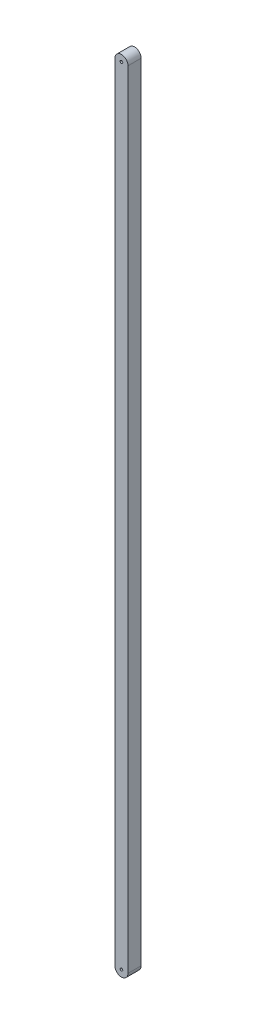
ISO-10303-21;
HEADER;
FILE_DESCRIPTION(('STEP AP214'),'2;1');
FILE_NAME('part.step','',(''),(''),'','','');
FILE_SCHEMA(('AUTOMOTIVE_DESIGN { 1 0 10303 214 1 1 1 1 }'));
ENDSEC;
DATA;
#1=APPLICATION_CONTEXT('core data for automotive mechanical design processes');
#2=APPLICATION_PROTOCOL_DEFINITION('international standard','automotive_design',2000,#1);
#3=PRODUCT_CONTEXT('',#1,'mechanical');
#4=PRODUCT('Part','Part','',(#3));
#5=PRODUCT_RELATED_PRODUCT_CATEGORY('part','',(#4));
#6=PRODUCT_DEFINITION_FORMATION('','',#4);
#7=PRODUCT_DEFINITION_CONTEXT('part definition',#1,'design');
#8=PRODUCT_DEFINITION('design','',#6,#7);
#9=PRODUCT_DEFINITION_SHAPE('','',#8);
#10=(LENGTH_UNIT() NAMED_UNIT(*) SI_UNIT(.MILLI.,.METRE.));
#11=(NAMED_UNIT(*) PLANE_ANGLE_UNIT() SI_UNIT($,.RADIAN.));
#12=(NAMED_UNIT(*) SI_UNIT($,.STERADIAN.) SOLID_ANGLE_UNIT());
#13=UNCERTAINTY_MEASURE_WITH_UNIT(LENGTH_MEASURE(1.E-05),#10,'distance_accuracy_value','');
#14=(GEOMETRIC_REPRESENTATION_CONTEXT(3) GLOBAL_UNCERTAINTY_ASSIGNED_CONTEXT((#13)) GLOBAL_UNIT_ASSIGNED_CONTEXT((#10,
#11,#12)) REPRESENTATION_CONTEXT('',''));
#15=CARTESIAN_POINT('',(0.,0.,0.));
#16=DIRECTION('',(0.,0.,1.));
#17=DIRECTION('',(1.,0.,0.));
#18=AXIS2_PLACEMENT_3D('',#15,#16,#17);
#19=CARTESIAN_POINT('',(0.,30.,0.5));
#20=DIRECTION('',(0.,0.,-1.));
#21=DIRECTION('',(-1.,0.,0.));
#22=AXIS2_PLACEMENT_3D('',#19,#20,#21);
#23=PLANE('',#22);
#24=CARTESIAN_POINT('',(0.,30.,0.5));
#25=DIRECTION('',(0.,0.,1.));
#26=DIRECTION('',(1.,0.,0.));
#27=AXIS2_PLACEMENT_3D('',#24,#25,#26);
#28=CIRCLE('',#27,0.0999999999999998);
#29=CARTESIAN_POINT('',(0.0999999999999998,30.,0.5));
#30=VERTEX_POINT('',#29);
#31=EDGE_CURVE('E95',#30,#30,#28,.T.);
#32=ORIENTED_EDGE('',*,*,#31,.F.);
#33=EDGE_LOOP('',(#32));
#34=FACE_BOUND('',#33,.T.);
#35=CARTESIAN_POINT('',(0.,30.,0.5));
#36=DIRECTION('',(0.,0.,1.));
#37=DIRECTION('',(-1.,0.,0.));
#38=AXIS2_PLACEMENT_3D('',#35,#36,#37);
#39=CIRCLE('',#38,0.5);
#40=CARTESIAN_POINT('',(0.5,30.,0.5));
#41=VERTEX_POINT('',#40);
#42=CARTESIAN_POINT('',(-0.5,30.,0.5));
#43=VERTEX_POINT('',#42);
#44=EDGE_CURVE('E105',#41,#43,#39,.T.);
#45=ORIENTED_EDGE('',*,*,#44,.T.);
#46=DIRECTION('',(0.,-1.,0.));
#47=VECTOR('',#46,1.);
#48=CARTESIAN_POINT('',(-0.5,30.,0.5));
#49=LINE('',#48,#47);
#50=CARTESIAN_POINT('',(-0.5,-30.,0.5));
#51=VERTEX_POINT('',#50);
#52=EDGE_CURVE('E90',#43,#51,#49,.T.);
#53=ORIENTED_EDGE('',*,*,#52,.T.);
#54=CARTESIAN_POINT('',(0.,-30.,0.5));
#55=DIRECTION('',(0.,0.,1.));
#56=DIRECTION('',(1.,0.,0.));
#57=AXIS2_PLACEMENT_3D('',#54,#55,#56);
#58=CIRCLE('',#57,0.5);
#59=CARTESIAN_POINT('',(0.5,-30.,0.5));
#60=VERTEX_POINT('',#59);
#61=EDGE_CURVE('E56',#51,#60,#58,.T.);
#62=ORIENTED_EDGE('',*,*,#61,.T.);
#63=DIRECTION('',(0.,1.,0.));
#64=VECTOR('',#63,1.);
#65=CARTESIAN_POINT('',(0.5,30.,0.5));
#66=LINE('',#65,#64);
#67=EDGE_CURVE('E51',#60,#41,#66,.T.);
#68=ORIENTED_EDGE('',*,*,#67,.T.);
#69=EDGE_LOOP('',(#45,#53,#62,#68));
#70=FACE_BOUND('',#69,.T.);
#71=CARTESIAN_POINT('',(0.,-30.,0.5));
#72=DIRECTION('',(0.,0.,1.));
#73=DIRECTION('',(1.,0.,0.));
#74=AXIS2_PLACEMENT_3D('',#71,#72,#73);
#75=CIRCLE('',#74,0.0999999999999998);
#76=CARTESIAN_POINT('',(0.0999999999999998,-30.,0.5));
#77=VERTEX_POINT('',#76);
#78=EDGE_CURVE('E123',#77,#77,#75,.T.);
#79=ORIENTED_EDGE('',*,*,#78,.F.);
#80=EDGE_LOOP('',(#79));
#81=FACE_BOUND('',#80,.T.);
#82=ADVANCED_FACE('F36',(#34,#70,#81),#23,.F.);
#83=CARTESIAN_POINT('',(0.,30.,-0.5));
#84=DIRECTION('',(0.,0.,-1.));
#85=DIRECTION('',(-1.,0.,0.));
#86=AXIS2_PLACEMENT_3D('',#83,#84,#85);
#87=PLANE('',#86);
#88=CARTESIAN_POINT('',(0.,30.,-0.5));
#89=DIRECTION('',(0.,0.,1.));
#90=DIRECTION('',(1.,0.,0.));
#91=AXIS2_PLACEMENT_3D('',#88,#89,#90);
#92=CIRCLE('',#91,0.0999999999999998);
#93=CARTESIAN_POINT('',(0.0999999999999998,30.,-0.5));
#94=VERTEX_POINT('',#93);
#95=EDGE_CURVE('E98',#94,#94,#92,.T.);
#96=ORIENTED_EDGE('',*,*,#95,.T.);
#97=EDGE_LOOP('',(#96));
#98=FACE_BOUND('',#97,.T.);
#99=CARTESIAN_POINT('',(0.,30.,-0.5));
#100=DIRECTION('',(0.,0.,1.));
#101=DIRECTION('',(-1.,0.,0.));
#102=AXIS2_PLACEMENT_3D('',#99,#100,#101);
#103=CIRCLE('',#102,0.5);
#104=CARTESIAN_POINT('',(0.5,30.,-0.5));
#105=VERTEX_POINT('',#104);
#106=CARTESIAN_POINT('',(-0.5,30.,-0.5));
#107=VERTEX_POINT('',#106);
#108=EDGE_CURVE('E82',#105,#107,#103,.T.);
#109=ORIENTED_EDGE('',*,*,#108,.F.);
#110=DIRECTION('',(0.,1.,0.));
#111=VECTOR('',#110,1.);
#112=CARTESIAN_POINT('',(0.5,30.,-0.5));
#113=LINE('',#112,#111);
#114=CARTESIAN_POINT('',(0.5,-30.,-0.5));
#115=VERTEX_POINT('',#114);
#116=EDGE_CURVE('E103',#115,#105,#113,.T.);
#117=ORIENTED_EDGE('',*,*,#116,.F.);
#118=CARTESIAN_POINT('',(0.,-30.,-0.5));
#119=DIRECTION('',(0.,0.,1.));
#120=DIRECTION('',(1.,0.,0.));
#121=AXIS2_PLACEMENT_3D('',#118,#119,#120);
#122=CIRCLE('',#121,0.5);
#123=CARTESIAN_POINT('',(-0.5,-30.,-0.5));
#124=VERTEX_POINT('',#123);
#125=EDGE_CURVE('E83',#124,#115,#122,.T.);
#126=ORIENTED_EDGE('',*,*,#125,.F.);
#127=DIRECTION('',(0.,-1.,0.));
#128=VECTOR('',#127,1.);
#129=CARTESIAN_POINT('',(-0.5,30.,-0.5));
#130=LINE('',#129,#128);
#131=EDGE_CURVE('E77',#107,#124,#130,.T.);
#132=ORIENTED_EDGE('',*,*,#131,.F.);
#133=EDGE_LOOP('',(#109,#117,#126,#132));
#134=FACE_BOUND('',#133,.T.);
#135=CARTESIAN_POINT('',(0.,-30.,-0.5));
#136=DIRECTION('',(0.,0.,1.));
#137=DIRECTION('',(1.,0.,0.));
#138=AXIS2_PLACEMENT_3D('',#135,#136,#137);
#139=CIRCLE('',#138,0.0999999999999998);
#140=CARTESIAN_POINT('',(0.0999999999999998,-30.,-0.5));
#141=VERTEX_POINT('',#140);
#142=EDGE_CURVE('E125',#141,#141,#139,.T.);
#143=ORIENTED_EDGE('',*,*,#142,.T.);
#144=EDGE_LOOP('',(#143));
#145=FACE_BOUND('',#144,.T.);
#146=ADVANCED_FACE('F78',(#98,#134,#145),#87,.T.);
#147=CARTESIAN_POINT('',(0.,30.,0.5));
#148=DIRECTION('',(0.,0.,-1.));
#149=DIRECTION('',(-1.,0.,0.));
#150=AXIS2_PLACEMENT_3D('',#147,#148,#149);
#151=CYLINDRICAL_SURFACE('',#150,0.5);
#152=ORIENTED_EDGE('',*,*,#108,.T.);
#153=DIRECTION('',(0.,0.,-1.));
#154=VECTOR('',#153,1.);
#155=CARTESIAN_POINT('',(-0.5,30.,0.5));
#156=LINE('',#155,#154);
#157=EDGE_CURVE('E11',#43,#107,#156,.T.);
#158=ORIENTED_EDGE('',*,*,#157,.F.);
#159=ORIENTED_EDGE('',*,*,#44,.F.);
#160=DIRECTION('',(0.,0.,-1.));
#161=VECTOR('',#160,1.);
#162=CARTESIAN_POINT('',(0.5,30.,0.5));
#163=LINE('',#162,#161);
#164=EDGE_CURVE('E94',#41,#105,#163,.T.);
#165=ORIENTED_EDGE('',*,*,#164,.T.);
#166=EDGE_LOOP('',(#152,#158,#159,#165));
#167=FACE_BOUND('',#166,.T.);
#168=ADVANCED_FACE('F38',(#167),#151,.T.);
#169=CARTESIAN_POINT('',(-0.5,30.,0.5));
#170=DIRECTION('',(1.,0.,0.));
#171=DIRECTION('',(0.,0.,-1.));
#172=AXIS2_PLACEMENT_3D('',#169,#170,#171);
#173=PLANE('',#172);
#174=ORIENTED_EDGE('',*,*,#131,.T.);
#175=DIRECTION('',(0.,0.,-1.));
#176=VECTOR('',#175,1.);
#177=CARTESIAN_POINT('',(-0.5,-30.,0.5));
#178=LINE('',#177,#176);
#179=EDGE_CURVE('E44',#51,#124,#178,.T.);
#180=ORIENTED_EDGE('',*,*,#179,.F.);
#181=ORIENTED_EDGE('',*,*,#52,.F.);
#182=ORIENTED_EDGE('',*,*,#157,.T.);
#183=EDGE_LOOP('',(#174,#180,#181,#182));
#184=FACE_BOUND('',#183,.T.);
#185=ADVANCED_FACE('F89',(#184),#173,.F.);
#186=CARTESIAN_POINT('',(0.,-30.,0.5));
#187=DIRECTION('',(0.,0.,-1.));
#188=DIRECTION('',(-1.,0.,0.));
#189=AXIS2_PLACEMENT_3D('',#186,#187,#188);
#190=CYLINDRICAL_SURFACE('',#189,0.5);
#191=ORIENTED_EDGE('',*,*,#125,.T.);
#192=DIRECTION('',(0.,0.,-1.));
#193=VECTOR('',#192,1.);
#194=CARTESIAN_POINT('',(0.5,-30.,0.5));
#195=LINE('',#194,#193);
#196=EDGE_CURVE('E111',#60,#115,#195,.T.);
#197=ORIENTED_EDGE('',*,*,#196,.F.);
#198=ORIENTED_EDGE('',*,*,#61,.F.);
#199=ORIENTED_EDGE('',*,*,#179,.T.);
#200=EDGE_LOOP('',(#191,#197,#198,#199));
#201=FACE_BOUND('',#200,.T.);
#202=ADVANCED_FACE('F114',(#201),#190,.T.);
#203=CARTESIAN_POINT('',(0.5,30.,0.5));
#204=DIRECTION('',(-1.,0.,0.));
#205=DIRECTION('',(0.,0.,1.));
#206=AXIS2_PLACEMENT_3D('',#203,#204,#205);
#207=PLANE('',#206);
#208=ORIENTED_EDGE('',*,*,#116,.T.);
#209=ORIENTED_EDGE('',*,*,#164,.F.);
#210=ORIENTED_EDGE('',*,*,#67,.F.);
#211=ORIENTED_EDGE('',*,*,#196,.T.);
#212=EDGE_LOOP('',(#208,#209,#210,#211));
#213=FACE_BOUND('',#212,.T.);
#214=ADVANCED_FACE('F116',(#213),#207,.F.);
#215=CARTESIAN_POINT('',(0.,30.,0.5));
#216=DIRECTION('',(0.,0.,-1.));
#217=DIRECTION('',(-1.,0.,0.));
#218=AXIS2_PLACEMENT_3D('',#215,#216,#217);
#219=CYLINDRICAL_SURFACE('',#218,0.0999999999999998);
#220=ORIENTED_EDGE('',*,*,#31,.T.);
#221=EDGE_LOOP('',(#220));
#222=FACE_BOUND('',#221,.T.);
#223=ORIENTED_EDGE('',*,*,#95,.F.);
#224=EDGE_LOOP('',(#223));
#225=FACE_BOUND('',#224,.T.);
#226=ADVANCED_FACE('F134',(#222,#225),#219,.F.);
#227=CARTESIAN_POINT('',(0.,-30.,0.5));
#228=DIRECTION('',(0.,0.,-1.));
#229=DIRECTION('',(-1.,0.,0.));
#230=AXIS2_PLACEMENT_3D('',#227,#228,#229);
#231=CYLINDRICAL_SURFACE('',#230,0.0999999999999998);
#232=ORIENTED_EDGE('',*,*,#78,.T.);
#233=EDGE_LOOP('',(#232));
#234=FACE_BOUND('',#233,.T.);
#235=ORIENTED_EDGE('',*,*,#142,.F.);
#236=EDGE_LOOP('',(#235));
#237=FACE_BOUND('',#236,.T.);
#238=ADVANCED_FACE('F132',(#234,#237),#231,.F.);
#239=CLOSED_SHELL('',(#82,#146,#168,#185,#202,#214,#226,#238));
#240=MANIFOLD_SOLID_BREP('B2',#239);
#241=ADVANCED_BREP_SHAPE_REPRESENTATION('',(#18,#240),#14);
#242=SHAPE_DEFINITION_REPRESENTATION(#9,#241);
ENDSEC;
END-ISO-10303-21;
